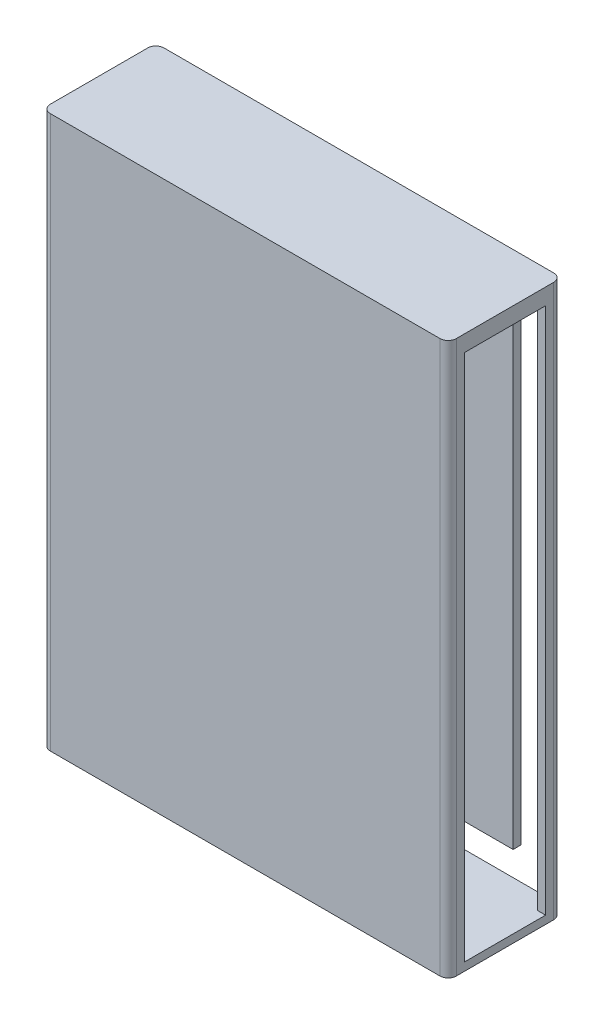
ISO-10303-21;
HEADER;
FILE_DESCRIPTION(('STEP AP214'),'2;1');
FILE_NAME('part.step','',(''),(''),'','','');
FILE_SCHEMA(('AUTOMOTIVE_DESIGN { 1 0 10303 214 1 1 1 1 }'));
ENDSEC;
DATA;
#1=APPLICATION_CONTEXT('core data for automotive mechanical design processes');
#2=APPLICATION_PROTOCOL_DEFINITION('international standard','automotive_design',2000,#1);
#3=PRODUCT_CONTEXT('',#1,'mechanical');
#4=PRODUCT('Part','Part','',(#3));
#5=PRODUCT_RELATED_PRODUCT_CATEGORY('part','',(#4));
#6=PRODUCT_DEFINITION_FORMATION('','',#4);
#7=PRODUCT_DEFINITION_CONTEXT('part definition',#1,'design');
#8=PRODUCT_DEFINITION('design','',#6,#7);
#9=PRODUCT_DEFINITION_SHAPE('','',#8);
#10=(LENGTH_UNIT() NAMED_UNIT(*) SI_UNIT(.MILLI.,.METRE.));
#11=(NAMED_UNIT(*) PLANE_ANGLE_UNIT() SI_UNIT($,.RADIAN.));
#12=(NAMED_UNIT(*) SI_UNIT($,.STERADIAN.) SOLID_ANGLE_UNIT());
#13=UNCERTAINTY_MEASURE_WITH_UNIT(LENGTH_MEASURE(1.E-05),#10,'distance_accuracy_value','');
#14=(GEOMETRIC_REPRESENTATION_CONTEXT(3) GLOBAL_UNCERTAINTY_ASSIGNED_CONTEXT((#13)) GLOBAL_UNIT_ASSIGNED_CONTEXT((#10,
#11,#12)) REPRESENTATION_CONTEXT('',''));
#15=CARTESIAN_POINT('',(0.,0.,0.));
#16=DIRECTION('',(0.,0.,1.));
#17=DIRECTION('',(1.,0.,0.));
#18=AXIS2_PLACEMENT_3D('',#15,#16,#17);
#19=CARTESIAN_POINT('',(-29.4178656451676,25.,-15.0492421233986));
#20=DIRECTION('',(0.,1.,0.));
#21=DIRECTION('',(-1.,0.,0.));
#22=AXIS2_PLACEMENT_3D('',#19,#20,#21);
#23=PLANE('',#22);
#24=DIRECTION('',(1.,0.,0.));
#25=VECTOR('',#24,1.);
#26=CARTESIAN_POINT('',(-29.4178656451676,25.,-15.0492421233986));
#27=LINE('',#26,#25);
#28=CARTESIAN_POINT('',(63.0821343548324,25.,-15.0492421233986));
#29=VERTEX_POINT('',#28);
#30=CARTESIAN_POINT('',(190.582134354832,25.,-15.0492421233986));
#31=VERTEX_POINT('',#30);
#32=EDGE_CURVE('E228',#29,#31,#27,.T.);
#33=ORIENTED_EDGE('',*,*,#32,.F.);
#34=DIRECTION('',(0.,0.,-1.));
#35=VECTOR('',#34,1.);
#36=CARTESIAN_POINT('',(63.0821343548324,25.,-15.0492421233986));
#37=LINE('',#36,#35);
#38=CARTESIAN_POINT('',(63.0821343548324,25.,-20.0492421233986));
#39=VERTEX_POINT('',#38);
#40=EDGE_CURVE('E55',#29,#39,#37,.T.);
#41=ORIENTED_EDGE('',*,*,#40,.T.);
#42=DIRECTION('',(1.,0.,0.));
#43=VECTOR('',#42,1.);
#44=CARTESIAN_POINT('',(-29.4178656451676,25.,-20.0492421233986));
#45=LINE('',#44,#43);
#46=CARTESIAN_POINT('',(190.582134354832,25.,-20.0492421233986));
#47=VERTEX_POINT('',#46);
#48=EDGE_CURVE('E226',#39,#47,#45,.T.);
#49=ORIENTED_EDGE('',*,*,#48,.T.);
#50=DIRECTION('',(0.,0.,-1.));
#51=VECTOR('',#50,1.);
#52=CARTESIAN_POINT('',(190.582134354832,25.,-15.0492421233986));
#53=LINE('',#52,#51);
#54=EDGE_CURVE('E262',#31,#47,#53,.T.);
#55=ORIENTED_EDGE('',*,*,#54,.F.);
#56=EDGE_LOOP('',(#33,#41,#49,#55));
#57=FACE_BOUND('',#56,.T.);
#58=ADVANCED_FACE('F46',(#57),#23,.F.);
#59=CARTESIAN_POINT('',(-34.4178656451675,340.,-20.0492421233986));
#60=DIRECTION('',(0.,0.,1.));
#61=DIRECTION('',(1.,0.,0.));
#62=AXIS2_PLACEMENT_3D('',#59,#60,#61);
#63=PLANE('',#62);
#64=ORIENTED_EDGE('',*,*,#48,.F.);
#65=DIRECTION('',(0.,-1.,0.));
#66=VECTOR('',#65,1.);
#67=CARTESIAN_POINT('',(63.0821343548324,29.,-20.0492421233986));
#68=LINE('',#67,#66);
#69=CARTESIAN_POINT('',(63.0821343548324,29.,-20.0492421233986));
#70=VERTEX_POINT('',#69);
#71=EDGE_CURVE('E210',#70,#39,#68,.T.);
#72=ORIENTED_EDGE('',*,*,#71,.F.);
#73=DIRECTION('',(1.,0.,0.));
#74=VECTOR('',#73,1.);
#75=CARTESIAN_POINT('',(63.0821343548324,29.,-20.0492421233986));
#76=LINE('',#75,#74);
#77=CARTESIAN_POINT('',(50.0821343548324,29.,-20.0492421233986));
#78=VERTEX_POINT('',#77);
#79=EDGE_CURVE('E483',#78,#70,#76,.T.);
#80=ORIENTED_EDGE('',*,*,#79,.F.);
#81=DIRECTION('',(0.,1.,0.));
#82=VECTOR('',#81,1.);
#83=CARTESIAN_POINT('',(50.0821343548324,29.,-20.0492421233986));
#84=LINE('',#83,#82);
#85=CARTESIAN_POINT('',(50.0821343548324,25.,-20.0492421233986));
#86=VERTEX_POINT('',#85);
#87=EDGE_CURVE('E221',#86,#78,#84,.T.);
#88=ORIENTED_EDGE('',*,*,#87,.F.);
#89=CARTESIAN_POINT('',(-29.4178656451676,25.,-20.0492421233986));
#90=VERTEX_POINT('',#89);
#91=EDGE_CURVE('E237',#90,#86,#45,.T.);
#92=ORIENTED_EDGE('',*,*,#91,.F.);
#93=DIRECTION('',(0.,-1.,0.));
#94=VECTOR('',#93,1.);
#95=CARTESIAN_POINT('',(-29.4178656451675,340.,-20.0492421233986));
#96=LINE('',#95,#94);
#97=CARTESIAN_POINT('',(-29.4178656451675,340.,-20.0492421233986));
#98=VERTEX_POINT('',#97);
#99=EDGE_CURVE('E366',#90,#98,#96,.F.);
#100=ORIENTED_EDGE('',*,*,#99,.T.);
#101=DIRECTION('',(-1.,0.,0.));
#102=VECTOR('',#101,1.);
#103=CARTESIAN_POINT('',(-34.4178656451675,340.,-20.0492421233986));
#104=LINE('',#103,#102);
#105=CARTESIAN_POINT('',(210.582134354832,340.,-20.0492421233986));
#106=VERTEX_POINT('',#105);
#107=EDGE_CURVE('E362',#106,#98,#104,.T.);
#108=ORIENTED_EDGE('',*,*,#107,.F.);
#109=DIRECTION('',(0.,-1.,0.));
#110=VECTOR('',#109,1.);
#111=CARTESIAN_POINT('',(210.582134354832,340.,-20.0492421233986));
#112=LINE('',#111,#110);
#113=CARTESIAN_POINT('',(210.582134354832,330.,-20.0492421233986));
#114=VERTEX_POINT('',#113);
#115=EDGE_CURVE('E388',#106,#114,#112,.T.);
#116=ORIENTED_EDGE('',*,*,#115,.T.);
#117=DIRECTION('',(1.,0.,0.));
#118=VECTOR('',#117,1.);
#119=CARTESIAN_POINT('',(210.582134354832,330.,-20.0492421233986));
#120=LINE('',#119,#118);
#121=CARTESIAN_POINT('',(190.582134354832,330.,-20.0492421233986));
#122=VERTEX_POINT('',#121);
#123=EDGE_CURVE('E250',#122,#114,#120,.T.);
#124=ORIENTED_EDGE('',*,*,#123,.F.);
#125=DIRECTION('',(0.,1.,0.));
#126=VECTOR('',#125,1.);
#127=CARTESIAN_POINT('',(190.582134354832,330.,-20.0492421233986));
#128=LINE('',#127,#126);
#129=EDGE_CURVE('E235',#47,#122,#128,.T.);
#130=ORIENTED_EDGE('',*,*,#129,.F.);
#131=EDGE_LOOP('',(#64,#72,#80,#88,#92,#100,#108,#116,#124,#130));
#132=FACE_BOUND('',#131,.T.);
#133=ADVANCED_FACE('F232',(#132),#63,.F.);
#134=CARTESIAN_POINT('',(-29.4178656451675,335.,44.9507578766014));
#135=DIRECTION('',(0.,0.,1.));
#136=DIRECTION('',(0.,-1.,0.));
#137=AXIS2_PLACEMENT_3D('',#134,#135,#136);
#138=PLANE('',#137);
#139=DIRECTION('',(0.,-1.,0.));
#140=VECTOR('',#139,1.);
#141=CARTESIAN_POINT('',(210.582134354832,335.,44.9507578766014));
#142=LINE('',#141,#140);
#143=CARTESIAN_POINT('',(210.582134354832,335.,44.9507578766014));
#144=VERTEX_POINT('',#143);
#145=CARTESIAN_POINT('',(210.582134354832,5.,44.9507578766014));
#146=VERTEX_POINT('',#145);
#147=EDGE_CURVE('E299',#144,#146,#142,.T.);
#148=ORIENTED_EDGE('',*,*,#147,.T.);
#149=DIRECTION('',(1.,0.,0.));
#150=VECTOR('',#149,1.);
#151=CARTESIAN_POINT('',(-29.4178656451675,5.,44.9507578766014));
#152=LINE('',#151,#150);
#153=CARTESIAN_POINT('',(-29.4178656451675,5.,44.9507578766014));
#154=VERTEX_POINT('',#153);
#155=EDGE_CURVE('E325',#154,#146,#152,.T.);
#156=ORIENTED_EDGE('',*,*,#155,.F.);
#157=DIRECTION('',(0.,-1.,0.));
#158=VECTOR('',#157,1.);
#159=CARTESIAN_POINT('',(-29.4178656451675,335.,44.9507578766014));
#160=LINE('',#159,#158);
#161=CARTESIAN_POINT('',(-29.4178656451675,335.,44.9507578766014));
#162=VERTEX_POINT('',#161);
#163=EDGE_CURVE('E309',#162,#154,#160,.T.);
#164=ORIENTED_EDGE('',*,*,#163,.F.);
#165=DIRECTION('',(1.,0.,0.));
#166=VECTOR('',#165,1.);
#167=CARTESIAN_POINT('',(-29.4178656451675,335.,44.9507578766014));
#168=LINE('',#167,#166);
#169=EDGE_CURVE('E340',#162,#144,#168,.T.);
#170=ORIENTED_EDGE('',*,*,#169,.T.);
#171=EDGE_LOOP('',(#148,#156,#164,#170));
#172=FACE_BOUND('',#171,.T.);
#173=ADVANCED_FACE('F512',(#172),#138,.F.);
#174=CARTESIAN_POINT('',(-29.4178656451675,335.,44.9507578766014));
#175=DIRECTION('',(0.,1.,0.));
#176=DIRECTION('',(0.,0.,1.));
#177=AXIS2_PLACEMENT_3D('',#174,#175,#176);
#178=PLANE('',#177);
#179=DIRECTION('',(0.,0.,1.));
#180=VECTOR('',#179,1.);
#181=CARTESIAN_POINT('',(210.582134354832,335.,44.9507578766014));
#182=LINE('',#181,#180);
#183=CARTESIAN_POINT('',(210.582134354832,335.,-15.0492421233986));
#184=VERTEX_POINT('',#183);
#185=EDGE_CURVE('E314',#184,#144,#182,.T.);
#186=ORIENTED_EDGE('',*,*,#185,.T.);
#187=ORIENTED_EDGE('',*,*,#169,.F.);
#188=DIRECTION('',(0.,0.,1.));
#189=VECTOR('',#188,1.);
#190=CARTESIAN_POINT('',(-29.4178656451675,335.,44.9507578766014));
#191=LINE('',#190,#189);
#192=CARTESIAN_POINT('',(-29.4178656451675,335.,-15.0492421233986));
#193=VERTEX_POINT('',#192);
#194=EDGE_CURVE('E321',#193,#162,#191,.T.);
#195=ORIENTED_EDGE('',*,*,#194,.F.);
#196=DIRECTION('',(1.,0.,0.));
#197=VECTOR('',#196,1.);
#198=CARTESIAN_POINT('',(-29.4178656451675,335.,-15.0492421233986));
#199=LINE('',#198,#197);
#200=EDGE_CURVE('E344',#193,#184,#199,.T.);
#201=ORIENTED_EDGE('',*,*,#200,.T.);
#202=EDGE_LOOP('',(#186,#187,#195,#201));
#203=FACE_BOUND('',#202,.T.);
#204=ADVANCED_FACE('F548',(#203),#178,.F.);
#205=CARTESIAN_POINT('',(-29.4178656451675,335.,-15.0492421233986));
#206=DIRECTION('',(0.,0.,-1.));
#207=DIRECTION('',(0.,1.,0.));
#208=AXIS2_PLACEMENT_3D('',#205,#206,#207);
#209=PLANE('',#208);
#210=DIRECTION('',(1.,0.,0.));
#211=VECTOR('',#210,1.);
#212=CARTESIAN_POINT('',(-29.4178656451676,29.,-15.0492421233986));
#213=LINE('',#212,#211);
#214=CARTESIAN_POINT('',(50.0821343548324,29.,-15.0492421233986));
#215=VERTEX_POINT('',#214);
#216=CARTESIAN_POINT('',(63.0821343548324,29.,-15.0492421233986));
#217=VERTEX_POINT('',#216);
#218=EDGE_CURVE('E11',#215,#217,#213,.T.);
#219=ORIENTED_EDGE('',*,*,#218,.T.);
#220=DIRECTION('',(0.,-1.,0.));
#221=VECTOR('',#220,1.);
#222=CARTESIAN_POINT('',(63.0821343548324,335.,-15.0492421233986));
#223=LINE('',#222,#221);
#224=EDGE_CURVE('E457',#217,#29,#223,.T.);
#225=ORIENTED_EDGE('',*,*,#224,.T.);
#226=ORIENTED_EDGE('',*,*,#32,.T.);
#227=DIRECTION('',(0.,1.,0.));
#228=VECTOR('',#227,1.);
#229=CARTESIAN_POINT('',(190.582134354832,330.,-15.0492421233986));
#230=LINE('',#229,#228);
#231=CARTESIAN_POINT('',(190.582134354832,330.,-15.0492421233986));
#232=VERTEX_POINT('',#231);
#233=EDGE_CURVE('E450',#31,#232,#230,.T.);
#234=ORIENTED_EDGE('',*,*,#233,.T.);
#235=DIRECTION('',(1.,0.,0.));
#236=VECTOR('',#235,1.);
#237=CARTESIAN_POINT('',(210.582134354832,330.,-15.0492421233986));
#238=LINE('',#237,#236);
#239=CARTESIAN_POINT('',(210.582134354832,330.,-15.0492421233986));
#240=VERTEX_POINT('',#239);
#241=EDGE_CURVE('E268',#232,#240,#238,.T.);
#242=ORIENTED_EDGE('',*,*,#241,.T.);
#243=DIRECTION('',(0.,1.,0.));
#244=VECTOR('',#243,1.);
#245=CARTESIAN_POINT('',(210.582134354832,335.,-15.0492421233986));
#246=LINE('',#245,#244);
#247=EDGE_CURVE('E334',#240,#184,#246,.T.);
#248=ORIENTED_EDGE('',*,*,#247,.T.);
#249=ORIENTED_EDGE('',*,*,#200,.F.);
#250=DIRECTION('',(0.,1.,0.));
#251=VECTOR('',#250,1.);
#252=CARTESIAN_POINT('',(-29.4178656451675,335.,-15.0492421233986));
#253=LINE('',#252,#251);
#254=CARTESIAN_POINT('',(-29.4178656451676,25.,-15.0492421233986));
#255=VERTEX_POINT('',#254);
#256=EDGE_CURVE('E318',#255,#193,#253,.T.);
#257=ORIENTED_EDGE('',*,*,#256,.F.);
#258=CARTESIAN_POINT('',(50.0821343548324,25.,-15.0492421233986));
#259=VERTEX_POINT('',#258);
#260=EDGE_CURVE('E441',#255,#259,#27,.T.);
#261=ORIENTED_EDGE('',*,*,#260,.T.);
#262=DIRECTION('',(0.,1.,0.));
#263=VECTOR('',#262,1.);
#264=CARTESIAN_POINT('',(50.0821343548324,335.,-15.0492421233986));
#265=LINE('',#264,#263);
#266=EDGE_CURVE('E62',#259,#215,#265,.T.);
#267=ORIENTED_EDGE('',*,*,#266,.T.);
#268=EDGE_LOOP('',(#219,#225,#226,#234,#242,#248,#249,#257,#261,#267));
#269=FACE_BOUND('',#268,.T.);
#270=ADVANCED_FACE('F447',(#269),#209,.F.);
#271=CARTESIAN_POINT('',(-29.4178656451675,5.,44.9507578766014));
#272=DIRECTION('',(0.,-1.,0.));
#273=DIRECTION('',(0.,0.,-1.));
#274=AXIS2_PLACEMENT_3D('',#271,#272,#273);
#275=PLANE('',#274);
#276=DIRECTION('',(0.,0.,-1.));
#277=VECTOR('',#276,1.);
#278=CARTESIAN_POINT('',(210.582134354832,5.,44.9507578766014));
#279=LINE('',#278,#277);
#280=CARTESIAN_POINT('',(210.582134354832,5.,39.9507578766014));
#281=VERTEX_POINT('',#280);
#282=EDGE_CURVE('E330',#146,#281,#279,.T.);
#283=ORIENTED_EDGE('',*,*,#282,.T.);
#284=DIRECTION('',(1.,0.,0.));
#285=VECTOR('',#284,1.);
#286=CARTESIAN_POINT('',(210.582134354832,5.,39.9507578766014));
#287=LINE('',#286,#285);
#288=CARTESIAN_POINT('',(215.582134354832,5.,39.9507578766014));
#289=VERTEX_POINT('',#288);
#290=EDGE_CURVE('E282',#281,#289,#287,.T.);
#291=ORIENTED_EDGE('',*,*,#290,.T.);
#292=DIRECTION('',(0.,0.,-1.));
#293=VECTOR('',#292,1.);
#294=CARTESIAN_POINT('',(215.582134354832,5.,39.9507578766014));
#295=LINE('',#294,#293);
#296=CARTESIAN_POINT('',(215.582134354832,5.,-10.0492421233986));
#297=VERTEX_POINT('',#296);
#298=EDGE_CURVE('E285',#289,#297,#295,.T.);
#299=ORIENTED_EDGE('',*,*,#298,.T.);
#300=DIRECTION('',(1.,0.,0.));
#301=VECTOR('',#300,1.);
#302=CARTESIAN_POINT('',(210.582134354832,5.,-10.0492421233986));
#303=LINE('',#302,#301);
#304=CARTESIAN_POINT('',(210.582134354832,5.,-10.0492421233986));
#305=VERTEX_POINT('',#304);
#306=EDGE_CURVE('E303',#305,#297,#303,.T.);
#307=ORIENTED_EDGE('',*,*,#306,.F.);
#308=CARTESIAN_POINT('',(210.582134354832,5.,-20.0492421233986));
#309=VERTEX_POINT('',#308);
#310=EDGE_CURVE('E329',#305,#309,#279,.T.);
#311=ORIENTED_EDGE('',*,*,#310,.T.);
#312=DIRECTION('',(-1.,0.,0.));
#313=VECTOR('',#312,1.);
#314=CARTESIAN_POINT('',(210.582134354832,5.,-20.0492421233986));
#315=LINE('',#314,#313);
#316=CARTESIAN_POINT('',(-29.4178656451676,5.,-20.0492421233986));
#317=VERTEX_POINT('',#316);
#318=EDGE_CURVE('E244',#309,#317,#315,.T.);
#319=ORIENTED_EDGE('',*,*,#318,.T.);
#320=DIRECTION('',(0.,0.,-1.));
#321=VECTOR('',#320,1.);
#322=CARTESIAN_POINT('',(-29.4178656451675,5.,44.9507578766014));
#323=LINE('',#322,#321);
#324=EDGE_CURVE('E313',#154,#317,#323,.T.);
#325=ORIENTED_EDGE('',*,*,#324,.F.);
#326=ORIENTED_EDGE('',*,*,#155,.T.);
#327=EDGE_LOOP('',(#283,#291,#299,#307,#311,#319,#325,#326));
#328=FACE_BOUND('',#327,.T.);
#329=ADVANCED_FACE('F472',(#328),#275,.F.);
#330=CARTESIAN_POINT('',(-29.4178656451675,0.,0.));
#331=DIRECTION('',(1.,0.,0.));
#332=DIRECTION('',(0.,0.,-1.));
#333=AXIS2_PLACEMENT_3D('',#330,#331,#332);
#334=PLANE('',#333);
#335=ORIENTED_EDGE('',*,*,#163,.T.);
#336=ORIENTED_EDGE('',*,*,#324,.T.);
#337=DIRECTION('',(0.,1.,0.));
#338=VECTOR('',#337,1.);
#339=CARTESIAN_POINT('',(-29.4178656451676,5.,-20.0492421233986));
#340=LINE('',#339,#338);
#341=EDGE_CURVE('E238',#317,#90,#340,.T.);
#342=ORIENTED_EDGE('',*,*,#341,.T.);
#343=DIRECTION('',(0.,0.,-1.));
#344=VECTOR('',#343,1.);
#345=CARTESIAN_POINT('',(-29.4178656451676,25.,-15.0492421233986));
#346=LINE('',#345,#344);
#347=EDGE_CURVE('E265',#255,#90,#346,.T.);
#348=ORIENTED_EDGE('',*,*,#347,.F.);
#349=ORIENTED_EDGE('',*,*,#256,.T.);
#350=ORIENTED_EDGE('',*,*,#194,.T.);
#351=EDGE_LOOP('',(#335,#336,#342,#348,#349,#350));
#352=FACE_BOUND('',#351,.T.);
#353=ADVANCED_FACE('F481',(#352),#334,.T.);
#354=CARTESIAN_POINT('',(210.582134354832,0.,0.));
#355=DIRECTION('',(1.,0.,0.));
#356=DIRECTION('',(0.,0.,-1.));
#357=AXIS2_PLACEMENT_3D('',#354,#355,#356);
#358=PLANE('',#357);
#359=DIRECTION('',(0.,0.,1.));
#360=VECTOR('',#359,1.);
#361=CARTESIAN_POINT('',(210.582134354832,330.,39.9507578766014));
#362=LINE('',#361,#360);
#363=CARTESIAN_POINT('',(210.582134354832,330.,-10.0492421233986));
#364=VERTEX_POINT('',#363);
#365=CARTESIAN_POINT('',(210.582134354832,330.,39.9507578766014));
#366=VERTEX_POINT('',#365);
#367=EDGE_CURVE('E278',#364,#366,#362,.T.);
#368=ORIENTED_EDGE('',*,*,#367,.T.);
#369=DIRECTION('',(0.,-1.,0.));
#370=VECTOR('',#369,1.);
#371=CARTESIAN_POINT('',(210.582134354832,330.,39.9507578766014));
#372=LINE('',#371,#370);
#373=EDGE_CURVE('E269',#366,#281,#372,.T.);
#374=ORIENTED_EDGE('',*,*,#373,.T.);
#375=ORIENTED_EDGE('',*,*,#282,.F.);
#376=ORIENTED_EDGE('',*,*,#147,.F.);
#377=ORIENTED_EDGE('',*,*,#185,.F.);
#378=ORIENTED_EDGE('',*,*,#247,.F.);
#379=DIRECTION('',(0.,0.,-1.));
#380=VECTOR('',#379,1.);
#381=CARTESIAN_POINT('',(210.582134354832,330.,-15.0492421233986));
#382=LINE('',#381,#380);
#383=EDGE_CURVE('E254',#240,#114,#382,.T.);
#384=ORIENTED_EDGE('',*,*,#383,.T.);
#385=DIRECTION('',(0.,-1.,0.));
#386=VECTOR('',#385,1.);
#387=CARTESIAN_POINT('',(210.582134354832,330.,-20.0492421233986));
#388=LINE('',#387,#386);
#389=EDGE_CURVE('E463',#114,#309,#388,.T.);
#390=ORIENTED_EDGE('',*,*,#389,.T.);
#391=ORIENTED_EDGE('',*,*,#310,.F.);
#392=DIRECTION('',(0.,1.,0.));
#393=VECTOR('',#392,1.);
#394=CARTESIAN_POINT('',(210.582134354832,330.,-10.0492421233986));
#395=LINE('',#394,#393);
#396=EDGE_CURVE('E273',#305,#364,#395,.T.);
#397=ORIENTED_EDGE('',*,*,#396,.T.);
#398=EDGE_LOOP('',(#368,#374,#375,#376,#377,#378,#384,#390,#391,#397));
#399=FACE_BOUND('',#398,.T.);
#400=ADVANCED_FACE('F544',(#399),#358,.F.);
#401=CARTESIAN_POINT('',(210.582134354832,330.,39.9507578766014));
#402=DIRECTION('',(0.,0.,1.));
#403=DIRECTION('',(0.,-1.,0.));
#404=AXIS2_PLACEMENT_3D('',#401,#402,#403);
#405=PLANE('',#404);
#406=DIRECTION('',(0.,-1.,0.));
#407=VECTOR('',#406,1.);
#408=CARTESIAN_POINT('',(215.582134354832,330.,39.9507578766014));
#409=LINE('',#408,#407);
#410=CARTESIAN_POINT('',(215.582134354832,330.,39.9507578766014));
#411=VERTEX_POINT('',#410);
#412=EDGE_CURVE('E258',#411,#289,#409,.T.);
#413=ORIENTED_EDGE('',*,*,#412,.T.);
#414=ORIENTED_EDGE('',*,*,#290,.F.);
#415=ORIENTED_EDGE('',*,*,#373,.F.);
#416=DIRECTION('',(1.,0.,0.));
#417=VECTOR('',#416,1.);
#418=CARTESIAN_POINT('',(210.582134354832,330.,39.9507578766014));
#419=LINE('',#418,#417);
#420=EDGE_CURVE('E296',#366,#411,#419,.T.);
#421=ORIENTED_EDGE('',*,*,#420,.T.);
#422=EDGE_LOOP('',(#413,#414,#415,#421));
#423=FACE_BOUND('',#422,.T.);
#424=ADVANCED_FACE('F554',(#423),#405,.F.);
#425=CARTESIAN_POINT('',(210.582134354832,330.,39.9507578766014));
#426=DIRECTION('',(0.,1.,0.));
#427=DIRECTION('',(0.,0.,1.));
#428=AXIS2_PLACEMENT_3D('',#425,#426,#427);
#429=PLANE('',#428);
#430=DIRECTION('',(0.,0.,1.));
#431=VECTOR('',#430,1.);
#432=CARTESIAN_POINT('',(215.582134354832,330.,39.9507578766014));
#433=LINE('',#432,#431);
#434=CARTESIAN_POINT('',(215.582134354832,330.,-10.0492421233986));
#435=VERTEX_POINT('',#434);
#436=EDGE_CURVE('E274',#435,#411,#433,.T.);
#437=ORIENTED_EDGE('',*,*,#436,.T.);
#438=ORIENTED_EDGE('',*,*,#420,.F.);
#439=ORIENTED_EDGE('',*,*,#367,.F.);
#440=DIRECTION('',(1.,0.,0.));
#441=VECTOR('',#440,1.);
#442=CARTESIAN_POINT('',(210.582134354832,330.,-10.0492421233986));
#443=LINE('',#442,#441);
#444=EDGE_CURVE('E300',#364,#435,#443,.T.);
#445=ORIENTED_EDGE('',*,*,#444,.T.);
#446=EDGE_LOOP('',(#437,#438,#439,#445));
#447=FACE_BOUND('',#446,.T.);
#448=ADVANCED_FACE('F670',(#447),#429,.F.);
#449=CARTESIAN_POINT('',(210.582134354832,330.,-10.0492421233986));
#450=DIRECTION('',(0.,0.,-1.));
#451=DIRECTION('',(0.,1.,0.));
#452=AXIS2_PLACEMENT_3D('',#449,#450,#451);
#453=PLANE('',#452);
#454=DIRECTION('',(0.,1.,0.));
#455=VECTOR('',#454,1.);
#456=CARTESIAN_POINT('',(215.582134354832,330.,-10.0492421233986));
#457=LINE('',#456,#455);
#458=EDGE_CURVE('E289',#297,#435,#457,.T.);
#459=ORIENTED_EDGE('',*,*,#458,.T.);
#460=ORIENTED_EDGE('',*,*,#444,.F.);
#461=ORIENTED_EDGE('',*,*,#396,.F.);
#462=ORIENTED_EDGE('',*,*,#306,.T.);
#463=EDGE_LOOP('',(#459,#460,#461,#462));
#464=FACE_BOUND('',#463,.T.);
#465=ADVANCED_FACE('F564',(#464),#453,.F.);
#466=CARTESIAN_POINT('',(-34.4178656451675,340.,-20.0492421233986));
#467=DIRECTION('',(1.,0.,0.));
#468=DIRECTION('',(0.,0.,-1.));
#469=AXIS2_PLACEMENT_3D('',#466,#467,#468);
#470=PLANE('',#469);
#471=DIRECTION('',(0.,0.,1.));
#472=VECTOR('',#471,1.);
#473=CARTESIAN_POINT('',(-34.4178656451675,0.,-20.0492421233986));
#474=LINE('',#473,#472);
#475=CARTESIAN_POINT('',(-34.4178656451675,0.,-15.0492421233986));
#476=VERTEX_POINT('',#475);
#477=CARTESIAN_POINT('',(-34.4178656451675,0.,44.9507578766014));
#478=VERTEX_POINT('',#477);
#479=EDGE_CURVE('E343',#476,#478,#474,.T.);
#480=ORIENTED_EDGE('',*,*,#479,.T.);
#481=DIRECTION('',(0.,-1.,0.));
#482=VECTOR('',#481,1.);
#483=CARTESIAN_POINT('',(-34.4178656451675,340.,44.9507578766014));
#484=LINE('',#483,#482);
#485=CARTESIAN_POINT('',(-34.4178656451675,340.,44.9507578766014));
#486=VERTEX_POINT('',#485);
#487=EDGE_CURVE('E433',#478,#486,#484,.F.);
#488=ORIENTED_EDGE('',*,*,#487,.T.);
#489=DIRECTION('',(0.,0.,1.));
#490=VECTOR('',#489,1.);
#491=CARTESIAN_POINT('',(-34.4178656451675,340.,-20.0492421233986));
#492=LINE('',#491,#490);
#493=CARTESIAN_POINT('',(-34.4178656451675,340.,-15.0492421233986));
#494=VERTEX_POINT('',#493);
#495=EDGE_CURVE('E350',#494,#486,#492,.T.);
#496=ORIENTED_EDGE('',*,*,#495,.F.);
#497=DIRECTION('',(0.,-1.,0.));
#498=VECTOR('',#497,1.);
#499=CARTESIAN_POINT('',(-34.4178656451675,340.,-15.0492421233986));
#500=LINE('',#499,#498);
#501=EDGE_CURVE('E429',#494,#476,#500,.T.);
#502=ORIENTED_EDGE('',*,*,#501,.T.);
#503=EDGE_LOOP('',(#480,#488,#496,#502));
#504=FACE_BOUND('',#503,.T.);
#505=ADVANCED_FACE('F577',(#504),#470,.F.);
#506=CARTESIAN_POINT('',(-34.4178656451675,340.,49.9507578766014));
#507=DIRECTION('',(0.,0.,-1.));
#508=DIRECTION('',(-1.,0.,0.));
#509=AXIS2_PLACEMENT_3D('',#506,#507,#508);
#510=PLANE('',#509);
#511=DIRECTION('',(1.,0.,0.));
#512=VECTOR('',#511,1.);
#513=CARTESIAN_POINT('',(-34.4178656451675,0.,49.9507578766014));
#514=LINE('',#513,#512);
#515=CARTESIAN_POINT('',(-29.4178656451675,0.,49.9507578766014));
#516=VERTEX_POINT('',#515);
#517=CARTESIAN_POINT('',(210.582134354832,0.,49.9507578766014));
#518=VERTEX_POINT('',#517);
#519=EDGE_CURVE('E370',#516,#518,#514,.T.);
#520=ORIENTED_EDGE('',*,*,#519,.T.);
#521=DIRECTION('',(0.,-1.,0.));
#522=VECTOR('',#521,1.);
#523=CARTESIAN_POINT('',(210.582134354832,340.,49.9507578766014));
#524=LINE('',#523,#522);
#525=CARTESIAN_POINT('',(210.582134354832,340.,49.9507578766014));
#526=VERTEX_POINT('',#525);
#527=EDGE_CURVE('E70',#518,#526,#524,.F.);
#528=ORIENTED_EDGE('',*,*,#527,.T.);
#529=DIRECTION('',(1.,0.,0.));
#530=VECTOR('',#529,1.);
#531=CARTESIAN_POINT('',(-34.4178656451675,340.,49.9507578766014));
#532=LINE('',#531,#530);
#533=CARTESIAN_POINT('',(-29.4178656451675,340.,49.9507578766014));
#534=VERTEX_POINT('',#533);
#535=EDGE_CURVE('E354',#534,#526,#532,.T.);
#536=ORIENTED_EDGE('',*,*,#535,.F.);
#537=DIRECTION('',(0.,-1.,0.));
#538=VECTOR('',#537,1.);
#539=CARTESIAN_POINT('',(-29.4178656451675,340.,49.9507578766014));
#540=LINE('',#539,#538);
#541=EDGE_CURVE('E423',#534,#516,#540,.T.);
#542=ORIENTED_EDGE('',*,*,#541,.T.);
#543=EDGE_LOOP('',(#520,#528,#536,#542));
#544=FACE_BOUND('',#543,.T.);
#545=ADVANCED_FACE('F586',(#544),#510,.F.);
#546=CARTESIAN_POINT('',(215.582134354832,340.,-20.0492421233986));
#547=DIRECTION('',(-1.,0.,0.));
#548=DIRECTION('',(0.,0.,1.));
#549=AXIS2_PLACEMENT_3D('',#546,#547,#548);
#550=PLANE('',#549);
#551=ORIENTED_EDGE('',*,*,#298,.F.);
#552=ORIENTED_EDGE('',*,*,#412,.F.);
#553=ORIENTED_EDGE('',*,*,#436,.F.);
#554=ORIENTED_EDGE('',*,*,#458,.F.);
#555=EDGE_LOOP('',(#551,#552,#553,#554));
#556=FACE_BOUND('',#555,.T.);
#557=DIRECTION('',(0.,0.,-1.));
#558=VECTOR('',#557,1.);
#559=CARTESIAN_POINT('',(215.582134354832,0.,-20.0492421233986));
#560=LINE('',#559,#558);
#561=CARTESIAN_POINT('',(215.582134354832,0.,44.9507578766014));
#562=VERTEX_POINT('',#561);
#563=CARTESIAN_POINT('',(215.582134354832,0.,-15.0492421233986));
#564=VERTEX_POINT('',#563);
#565=EDGE_CURVE('E373',#562,#564,#560,.T.);
#566=ORIENTED_EDGE('',*,*,#565,.T.);
#567=DIRECTION('',(0.,-1.,0.));
#568=VECTOR('',#567,1.);
#569=CARTESIAN_POINT('',(215.582134354832,340.,-15.0492421233986));
#570=LINE('',#569,#568);
#571=CARTESIAN_POINT('',(215.582134354832,340.,-15.0492421233986));
#572=VERTEX_POINT('',#571);
#573=EDGE_CURVE('E408',#564,#572,#570,.F.);
#574=ORIENTED_EDGE('',*,*,#573,.T.);
#575=DIRECTION('',(0.,0.,-1.));
#576=VECTOR('',#575,1.);
#577=CARTESIAN_POINT('',(215.582134354832,340.,-20.0492421233986));
#578=LINE('',#577,#576);
#579=CARTESIAN_POINT('',(215.582134354832,340.,44.9507578766014));
#580=VERTEX_POINT('',#579);
#581=EDGE_CURVE('E358',#580,#572,#578,.T.);
#582=ORIENTED_EDGE('',*,*,#581,.F.);
#583=DIRECTION('',(0.,-1.,0.));
#584=VECTOR('',#583,1.);
#585=CARTESIAN_POINT('',(215.582134354832,340.,44.9507578766014));
#586=LINE('',#585,#584);
#587=EDGE_CURVE('E404',#580,#562,#586,.T.);
#588=ORIENTED_EDGE('',*,*,#587,.T.);
#589=EDGE_LOOP('',(#566,#574,#582,#588));
#590=FACE_BOUND('',#589,.T.);
#591=ADVANCED_FACE('F559',(#556,#590),#550,.F.);
#592=ORIENTED_EDGE('',*,*,#318,.F.);
#593=DIRECTION('',(0.,-1.,0.));
#594=VECTOR('',#593,1.);
#595=CARTESIAN_POINT('',(210.582134354832,340.,-20.0492421233986));
#596=LINE('',#595,#594);
#597=CARTESIAN_POINT('',(210.582134354832,0.,-20.0492421233986));
#598=VERTEX_POINT('',#597);
#599=EDGE_CURVE('E385',#309,#598,#596,.T.);
#600=ORIENTED_EDGE('',*,*,#599,.T.);
#601=DIRECTION('',(-1.,0.,0.));
#602=VECTOR('',#601,1.);
#603=CARTESIAN_POINT('',(-34.4178656451675,0.,-20.0492421233986));
#604=LINE('',#603,#602);
#605=CARTESIAN_POINT('',(-29.4178656451675,0.,-20.0492421233986));
#606=VERTEX_POINT('',#605);
#607=EDGE_CURVE('E355',#598,#606,#604,.T.);
#608=ORIENTED_EDGE('',*,*,#607,.T.);
#609=DIRECTION('',(0.,-1.,0.));
#610=VECTOR('',#609,1.);
#611=CARTESIAN_POINT('',(-29.4178656451675,340.,-20.0492421233986));
#612=LINE('',#611,#610);
#613=EDGE_CURVE('E382',#606,#317,#612,.F.);
#614=ORIENTED_EDGE('',*,*,#613,.T.);
#615=EDGE_LOOP('',(#592,#600,#608,#614));
#616=FACE_BOUND('',#615,.T.);
#617=ADVANCED_FACE('F514',(#616),#63,.F.);
#618=CARTESIAN_POINT('',(0.,340.,0.));
#619=DIRECTION('',(0.,1.,0.));
#620=DIRECTION('',(0.,0.,1.));
#621=AXIS2_PLACEMENT_3D('',#618,#619,#620);
#622=PLANE('',#621);
#623=ORIENTED_EDGE('',*,*,#581,.T.);
#624=CARTESIAN_POINT('',(210.582134354832,340.,-15.0492421233986));
#625=DIRECTION('',(0.,1.,0.));
#626=DIRECTION('',(0.,0.,1.));
#627=AXIS2_PLACEMENT_3D('',#624,#625,#626);
#628=CIRCLE('',#627,5.);
#629=EDGE_CURVE('E420',#572,#106,#628,.T.);
#630=ORIENTED_EDGE('',*,*,#629,.T.);
#631=ORIENTED_EDGE('',*,*,#107,.T.);
#632=CARTESIAN_POINT('',(-29.4178656451675,340.,-15.0492421233986));
#633=DIRECTION('',(0.,1.,0.));
#634=DIRECTION('',(0.,0.,1.));
#635=AXIS2_PLACEMENT_3D('',#632,#633,#634);
#636=CIRCLE('',#635,5.);
#637=EDGE_CURVE('E411',#98,#494,#636,.T.);
#638=ORIENTED_EDGE('',*,*,#637,.T.);
#639=ORIENTED_EDGE('',*,*,#495,.T.);
#640=CARTESIAN_POINT('',(-29.4178656451675,340.,44.9507578766014));
#641=DIRECTION('',(0.,1.,0.));
#642=DIRECTION('',(0.,0.,1.));
#643=AXIS2_PLACEMENT_3D('',#640,#641,#642);
#644=CIRCLE('',#643,5.);
#645=EDGE_CURVE('E414',#486,#534,#644,.T.);
#646=ORIENTED_EDGE('',*,*,#645,.T.);
#647=ORIENTED_EDGE('',*,*,#535,.T.);
#648=CARTESIAN_POINT('',(210.582134354832,340.,44.9507578766014));
#649=DIRECTION('',(0.,1.,0.));
#650=DIRECTION('',(0.,0.,1.));
#651=AXIS2_PLACEMENT_3D('',#648,#649,#650);
#652=CIRCLE('',#651,5.);
#653=EDGE_CURVE('E417',#526,#580,#652,.T.);
#654=ORIENTED_EDGE('',*,*,#653,.T.);
#655=EDGE_LOOP('',(#623,#630,#631,#638,#639,#646,#647,#654));
#656=FACE_BOUND('',#655,.T.);
#657=ADVANCED_FACE('F581',(#656),#622,.T.);
#658=CARTESIAN_POINT('',(0.,0.,0.));
#659=DIRECTION('',(0.,1.,0.));
#660=DIRECTION('',(0.,0.,1.));
#661=AXIS2_PLACEMENT_3D('',#658,#659,#660);
#662=PLANE('',#661);
#663=ORIENTED_EDGE('',*,*,#607,.F.);
#664=CARTESIAN_POINT('',(210.582134354832,0.,-15.0492421233986));
#665=DIRECTION('',(0.,1.,0.));
#666=DIRECTION('',(0.,0.,1.));
#667=AXIS2_PLACEMENT_3D('',#664,#665,#666);
#668=CIRCLE('',#667,5.);
#669=EDGE_CURVE('E401',#598,#564,#668,.F.);
#670=ORIENTED_EDGE('',*,*,#669,.T.);
#671=ORIENTED_EDGE('',*,*,#565,.F.);
#672=CARTESIAN_POINT('',(210.582134354832,0.,44.9507578766014));
#673=DIRECTION('',(0.,1.,0.));
#674=DIRECTION('',(0.,0.,1.));
#675=AXIS2_PLACEMENT_3D('',#672,#673,#674);
#676=CIRCLE('',#675,5.);
#677=EDGE_CURVE('E398',#562,#518,#676,.F.);
#678=ORIENTED_EDGE('',*,*,#677,.T.);
#679=ORIENTED_EDGE('',*,*,#519,.F.);
#680=CARTESIAN_POINT('',(-29.4178656451675,0.,44.9507578766014));
#681=DIRECTION('',(0.,1.,0.));
#682=DIRECTION('',(0.,0.,1.));
#683=AXIS2_PLACEMENT_3D('',#680,#681,#682);
#684=CIRCLE('',#683,5.);
#685=EDGE_CURVE('E395',#516,#478,#684,.F.);
#686=ORIENTED_EDGE('',*,*,#685,.T.);
#687=ORIENTED_EDGE('',*,*,#479,.F.);
#688=CARTESIAN_POINT('',(-29.4178656451675,0.,-15.0492421233986));
#689=DIRECTION('',(0.,1.,0.));
#690=DIRECTION('',(0.,0.,1.));
#691=AXIS2_PLACEMENT_3D('',#688,#689,#690);
#692=CIRCLE('',#691,5.);
#693=EDGE_CURVE('E392',#476,#606,#692,.F.);
#694=ORIENTED_EDGE('',*,*,#693,.T.);
#695=EDGE_LOOP('',(#663,#670,#671,#678,#679,#686,#687,#694));
#696=FACE_BOUND('',#695,.T.);
#697=ADVANCED_FACE('F536',(#696),#662,.F.);
#698=CARTESIAN_POINT('',(210.582134354832,330.,-15.0492421233986));
#699=DIRECTION('',(0.,1.,0.));
#700=DIRECTION('',(0.,0.,1.));
#701=AXIS2_PLACEMENT_3D('',#698,#699,#700);
#702=PLANE('',#701);
#703=ORIENTED_EDGE('',*,*,#123,.T.);
#704=ORIENTED_EDGE('',*,*,#383,.F.);
#705=ORIENTED_EDGE('',*,*,#241,.F.);
#706=DIRECTION('',(0.,0.,-1.));
#707=VECTOR('',#706,1.);
#708=CARTESIAN_POINT('',(190.582134354832,330.,-15.0492421233986));
#709=LINE('',#708,#707);
#710=EDGE_CURVE('E259',#232,#122,#709,.T.);
#711=ORIENTED_EDGE('',*,*,#710,.T.);
#712=EDGE_LOOP('',(#703,#704,#705,#711));
#713=FACE_BOUND('',#712,.T.);
#714=ADVANCED_FACE('F529',(#713),#702,.F.);
#715=CARTESIAN_POINT('',(190.582134354832,330.,-15.0492421233986));
#716=DIRECTION('',(-1.,0.,0.));
#717=DIRECTION('',(0.,-1.,0.));
#718=AXIS2_PLACEMENT_3D('',#715,#716,#717);
#719=PLANE('',#718);
#720=ORIENTED_EDGE('',*,*,#129,.T.);
#721=ORIENTED_EDGE('',*,*,#710,.F.);
#722=ORIENTED_EDGE('',*,*,#233,.F.);
#723=ORIENTED_EDGE('',*,*,#54,.T.);
#724=EDGE_LOOP('',(#720,#721,#722,#723));
#725=FACE_BOUND('',#724,.T.);
#726=ADVANCED_FACE('F519',(#725),#719,.F.);
#727=ORIENTED_EDGE('',*,*,#91,.T.);
#728=DIRECTION('',(0.,0.,1.));
#729=VECTOR('',#728,1.);
#730=CARTESIAN_POINT('',(50.0821343548324,25.,-15.0492421233986));
#731=LINE('',#730,#729);
#732=EDGE_CURVE('E230',#86,#259,#731,.T.);
#733=ORIENTED_EDGE('',*,*,#732,.T.);
#734=ORIENTED_EDGE('',*,*,#260,.F.);
#735=ORIENTED_EDGE('',*,*,#347,.T.);
#736=EDGE_LOOP('',(#727,#733,#734,#735));
#737=FACE_BOUND('',#736,.T.);
#738=ADVANCED_FACE('F440',(#737),#23,.F.);
#739=CARTESIAN_POINT('',(210.582134354832,340.,-15.0492421233986));
#740=DIRECTION('',(0.,-1.,0.));
#741=DIRECTION('',(0.,0.,-1.));
#742=AXIS2_PLACEMENT_3D('',#739,#740,#741);
#743=CYLINDRICAL_SURFACE('',#742,5.);
#744=ORIENTED_EDGE('',*,*,#629,.F.);
#745=ORIENTED_EDGE('',*,*,#573,.F.);
#746=ORIENTED_EDGE('',*,*,#669,.F.);
#747=ORIENTED_EDGE('',*,*,#599,.F.);
#748=ORIENTED_EDGE('',*,*,#389,.F.);
#749=ORIENTED_EDGE('',*,*,#115,.F.);
#750=EDGE_LOOP('',(#744,#745,#746,#747,#748,#749));
#751=FACE_BOUND('',#750,.T.);
#752=ADVANCED_FACE('F518',(#751),#743,.T.);
#753=CARTESIAN_POINT('',(210.582134354832,340.,44.9507578766014));
#754=DIRECTION('',(0.,-1.,0.));
#755=DIRECTION('',(0.,0.,-1.));
#756=AXIS2_PLACEMENT_3D('',#753,#754,#755);
#757=CYLINDRICAL_SURFACE('',#756,5.);
#758=ORIENTED_EDGE('',*,*,#653,.F.);
#759=ORIENTED_EDGE('',*,*,#527,.F.);
#760=ORIENTED_EDGE('',*,*,#677,.F.);
#761=ORIENTED_EDGE('',*,*,#587,.F.);
#762=EDGE_LOOP('',(#758,#759,#760,#761));
#763=FACE_BOUND('',#762,.T.);
#764=ADVANCED_FACE('F525',(#763),#757,.T.);
#765=CARTESIAN_POINT('',(-29.4178656451675,340.,44.9507578766014));
#766=DIRECTION('',(0.,-1.,0.));
#767=DIRECTION('',(0.,0.,-1.));
#768=AXIS2_PLACEMENT_3D('',#765,#766,#767);
#769=CYLINDRICAL_SURFACE('',#768,5.);
#770=ORIENTED_EDGE('',*,*,#645,.F.);
#771=ORIENTED_EDGE('',*,*,#487,.F.);
#772=ORIENTED_EDGE('',*,*,#685,.F.);
#773=ORIENTED_EDGE('',*,*,#541,.F.);
#774=EDGE_LOOP('',(#770,#771,#772,#773));
#775=FACE_BOUND('',#774,.T.);
#776=ADVANCED_FACE('F584',(#775),#769,.T.);
#777=CARTESIAN_POINT('',(-29.4178656451675,340.,-15.0492421233986));
#778=DIRECTION('',(0.,-1.,0.));
#779=DIRECTION('',(0.,0.,-1.));
#780=AXIS2_PLACEMENT_3D('',#777,#778,#779);
#781=CYLINDRICAL_SURFACE('',#780,5.);
#782=ORIENTED_EDGE('',*,*,#341,.F.);
#783=ORIENTED_EDGE('',*,*,#613,.F.);
#784=ORIENTED_EDGE('',*,*,#693,.F.);
#785=ORIENTED_EDGE('',*,*,#501,.F.);
#786=ORIENTED_EDGE('',*,*,#637,.F.);
#787=ORIENTED_EDGE('',*,*,#99,.F.);
#788=EDGE_LOOP('',(#782,#783,#784,#785,#786,#787));
#789=FACE_BOUND('',#788,.T.);
#790=ADVANCED_FACE('F48',(#789),#781,.T.);
#791=CARTESIAN_POINT('',(63.0821343548324,29.,-10.0492421233986));
#792=DIRECTION('',(0.,1.,0.));
#793=DIRECTION('',(-1.,0.,0.));
#794=AXIS2_PLACEMENT_3D('',#791,#792,#793);
#795=PLANE('',#794);
#796=DIRECTION('',(0.,0.,-1.));
#797=VECTOR('',#796,1.);
#798=CARTESIAN_POINT('',(50.0821343548324,29.,-10.0492421233986));
#799=LINE('',#798,#797);
#800=EDGE_CURVE('E487',#215,#78,#799,.T.);
#801=ORIENTED_EDGE('',*,*,#800,.T.);
#802=ORIENTED_EDGE('',*,*,#79,.T.);
#803=DIRECTION('',(0.,0.,-1.));
#804=VECTOR('',#803,1.);
#805=CARTESIAN_POINT('',(63.0821343548324,29.,-10.0492421233986));
#806=LINE('',#805,#804);
#807=EDGE_CURVE('E215',#217,#70,#806,.T.);
#808=ORIENTED_EDGE('',*,*,#807,.F.);
#809=ORIENTED_EDGE('',*,*,#218,.F.);
#810=EDGE_LOOP('',(#801,#802,#808,#809));
#811=FACE_BOUND('',#810,.T.);
#812=ADVANCED_FACE('F497',(#811),#795,.F.);
#813=CARTESIAN_POINT('',(63.0821343548324,29.,-10.0492421233986));
#814=DIRECTION('',(1.,0.,0.));
#815=DIRECTION('',(0.,0.,-1.));
#816=AXIS2_PLACEMENT_3D('',#813,#814,#815);
#817=PLANE('',#816);
#818=ORIENTED_EDGE('',*,*,#807,.T.);
#819=ORIENTED_EDGE('',*,*,#71,.T.);
#820=ORIENTED_EDGE('',*,*,#40,.F.);
#821=ORIENTED_EDGE('',*,*,#224,.F.);
#822=EDGE_LOOP('',(#818,#819,#820,#821));
#823=FACE_BOUND('',#822,.T.);
#824=ADVANCED_FACE('F212',(#823),#817,.F.);
#825=CARTESIAN_POINT('',(50.0821343548324,29.,-10.0492421233986));
#826=DIRECTION('',(-1.,0.,0.));
#827=DIRECTION('',(0.,0.,1.));
#828=AXIS2_PLACEMENT_3D('',#825,#826,#827);
#829=PLANE('',#828);
#830=ORIENTED_EDGE('',*,*,#732,.F.);
#831=ORIENTED_EDGE('',*,*,#87,.T.);
#832=ORIENTED_EDGE('',*,*,#800,.F.);
#833=ORIENTED_EDGE('',*,*,#266,.F.);
#834=EDGE_LOOP('',(#830,#831,#832,#833));
#835=FACE_BOUND('',#834,.T.);
#836=ADVANCED_FACE('F498',(#835),#829,.F.);
#837=CLOSED_SHELL('',(#58,#133,#173,#204,#270,#329,#353,#400,#424,#448,#465,#505,#545,#591,#617,
#657,#697,#714,#726,#738,#752,#764,#776,#790,#812,#824,#836));
#838=MANIFOLD_SOLID_BREP('B2',#837);
#839=ADVANCED_BREP_SHAPE_REPRESENTATION('',(#18,#838),#14);
#840=SHAPE_DEFINITION_REPRESENTATION(#9,#839);
ENDSEC;
END-ISO-10303-21;
